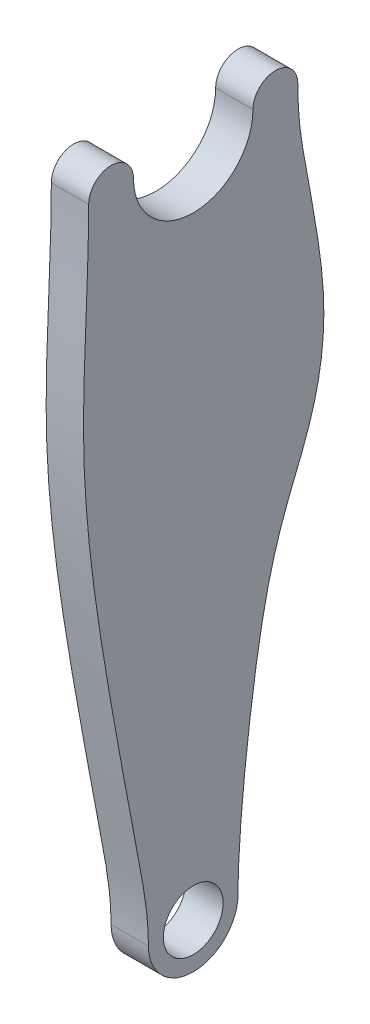
ISO-10303-21;
HEADER;
FILE_DESCRIPTION(('STEP AP214'),'2;1');
FILE_NAME('part.step','',(''),(''),'','','');
FILE_SCHEMA(('AUTOMOTIVE_DESIGN { 1 0 10303 214 1 1 1 1 }'));
ENDSEC;
DATA;
#1=APPLICATION_CONTEXT('core data for automotive mechanical design processes');
#2=APPLICATION_PROTOCOL_DEFINITION('international standard','automotive_design',2000,#1);
#3=PRODUCT_CONTEXT('',#1,'mechanical');
#4=PRODUCT('Part','Part','',(#3));
#5=PRODUCT_RELATED_PRODUCT_CATEGORY('part','',(#4));
#6=PRODUCT_DEFINITION_FORMATION('','',#4);
#7=PRODUCT_DEFINITION_CONTEXT('part definition',#1,'design');
#8=PRODUCT_DEFINITION('design','',#6,#7);
#9=PRODUCT_DEFINITION_SHAPE('','',#8);
#10=(LENGTH_UNIT() NAMED_UNIT(*) SI_UNIT(.MILLI.,.METRE.));
#11=(NAMED_UNIT(*) PLANE_ANGLE_UNIT() SI_UNIT($,.RADIAN.));
#12=(NAMED_UNIT(*) SI_UNIT($,.STERADIAN.) SOLID_ANGLE_UNIT());
#13=UNCERTAINTY_MEASURE_WITH_UNIT(LENGTH_MEASURE(1.E-05),#10,'distance_accuracy_value','');
#14=(GEOMETRIC_REPRESENTATION_CONTEXT(3) GLOBAL_UNCERTAINTY_ASSIGNED_CONTEXT((#13)) GLOBAL_UNIT_ASSIGNED_CONTEXT((#10,
#11,#12)) REPRESENTATION_CONTEXT('',''));
#15=CARTESIAN_POINT('',(0.,0.,0.));
#16=DIRECTION('',(0.,0.,1.));
#17=DIRECTION('',(1.,0.,0.));
#18=AXIS2_PLACEMENT_3D('',#15,#16,#17);
#19=CARTESIAN_POINT('',(10.,0.,-28.));
#20=CARTESIAN_POINT('',(10.,-7.11889913552066,-28.));
#21=CARTESIAN_POINT('',(10.,-17.3743165491548,-29.3200373597356));
#22=CARTESIAN_POINT('',(10.,-65.1845773304526,-39.2187090072054));
#23=CARTESIAN_POINT('',(10.,-94.6220418180742,-24.4893893604008));
#24=CARTESIAN_POINT('',(10.,-123.05598928135,-16.8395502400097));
#25=CARTESIAN_POINT('',(10.,-165.456503480137,-12.));
#26=CARTESIAN_POINT('',(10.,-180.,-12.));
#27=B_SPLINE_CURVE_WITH_KNOTS('',3,(#19,#20,#21,#22,#23,#24,#25,#26),.UNSPECIFIED.,.F.,.F.,(4,1,
1,1,1,4),(0.,0.0842862465994689,0.187609719140455,0.382215489080244,0.559766900242752,
0.781850651208779),.UNSPECIFIED.);
#28=DIRECTION('',(-1.,0.,0.));
#29=VECTOR('',#28,1.);
#30=SURFACE_OF_LINEAR_EXTRUSION('',#27,#29);
#31=CARTESIAN_POINT('',(0.,0.,-28.));
#32=CARTESIAN_POINT('',(0.,-7.11889913552066,-28.));
#33=CARTESIAN_POINT('',(0.,-17.3743165491548,-29.3200373597356));
#34=CARTESIAN_POINT('',(0.,-65.1845773304526,-39.2187090072054));
#35=CARTESIAN_POINT('',(0.,-94.6220418180742,-24.4893893604008));
#36=CARTESIAN_POINT('',(0.,-123.05598928135,-16.8395502400097));
#37=CARTESIAN_POINT('',(0.,-165.456503480137,-12.));
#38=CARTESIAN_POINT('',(0.,-180.,-12.));
#39=B_SPLINE_CURVE_WITH_KNOTS('',3,(#31,#32,#33,#34,#35,#36,#37,#38),.UNSPECIFIED.,.F.,.F.,(4,1,
1,1,1,4),(0.,0.0842862465994689,0.187609719140455,0.382215489080244,0.559766900242752,
0.781850651208779),.UNSPECIFIED.);
#40=CARTESIAN_POINT('',(0.,0.,-28.));
#41=VERTEX_POINT('',#40);
#42=CARTESIAN_POINT('',(0.,-180.,-12.));
#43=VERTEX_POINT('',#42);
#44=EDGE_CURVE('E159',#41,#43,#39,.T.);
#45=ORIENTED_EDGE('',*,*,#44,.F.);
#46=DIRECTION('',(-1.,0.,0.));
#47=VECTOR('',#46,1.);
#48=CARTESIAN_POINT('',(10.,0.,-28.));
#49=LINE('',#48,#47);
#50=CARTESIAN_POINT('',(10.,0.,-28.));
#51=VERTEX_POINT('',#50);
#52=EDGE_CURVE('E11',#51,#41,#49,.T.);
#53=ORIENTED_EDGE('',*,*,#52,.F.);
#54=CARTESIAN_POINT('',(10.,-180.,-12.));
#55=VERTEX_POINT('',#54);
#56=EDGE_CURVE('E186',#51,#55,#27,.T.);
#57=ORIENTED_EDGE('',*,*,#56,.T.);
#58=DIRECTION('',(-1.,0.,0.));
#59=VECTOR('',#58,1.);
#60=CARTESIAN_POINT('',(10.,-180.,-12.));
#61=LINE('',#60,#59);
#62=EDGE_CURVE('E57',#55,#43,#61,.T.);
#63=ORIENTED_EDGE('',*,*,#62,.T.);
#64=EDGE_LOOP('',(#45,#53,#57,#63));
#65=FACE_BOUND('',#64,.T.);
#66=ADVANCED_FACE('F39',(#65),#30,.T.);
#67=CARTESIAN_POINT('',(10.,0.,-22.));
#68=DIRECTION('',(-1.,0.,0.));
#69=DIRECTION('',(0.,0.,1.));
#70=AXIS2_PLACEMENT_3D('',#67,#68,#69);
#71=CYLINDRICAL_SURFACE('',#70,6.);
#72=CARTESIAN_POINT('',(0.,0.,-22.));
#73=DIRECTION('',(1.,0.,0.));
#74=DIRECTION('',(0.,0.,-1.));
#75=AXIS2_PLACEMENT_3D('',#72,#73,#74);
#76=CIRCLE('',#75,6.);
#77=CARTESIAN_POINT('',(0.,0.,-16.));
#78=VERTEX_POINT('',#77);
#79=EDGE_CURVE('E153',#78,#41,#76,.F.);
#80=ORIENTED_EDGE('',*,*,#79,.F.);
#81=DIRECTION('',(-1.,0.,0.));
#82=VECTOR('',#81,1.);
#83=CARTESIAN_POINT('',(10.,0.,-16.));
#84=LINE('',#83,#82);
#85=CARTESIAN_POINT('',(10.,0.,-16.));
#86=VERTEX_POINT('',#85);
#87=EDGE_CURVE('E49',#86,#78,#84,.T.);
#88=ORIENTED_EDGE('',*,*,#87,.F.);
#89=CARTESIAN_POINT('',(10.,0.,-22.));
#90=DIRECTION('',(1.,0.,0.));
#91=DIRECTION('',(0.,0.,-1.));
#92=AXIS2_PLACEMENT_3D('',#89,#90,#91);
#93=CIRCLE('',#92,6.);
#94=EDGE_CURVE('E194',#86,#51,#93,.F.);
#95=ORIENTED_EDGE('',*,*,#94,.T.);
#96=ORIENTED_EDGE('',*,*,#52,.T.);
#97=EDGE_LOOP('',(#80,#88,#95,#96));
#98=FACE_BOUND('',#97,.T.);
#99=ADVANCED_FACE('F144',(#98),#71,.T.);
#100=CARTESIAN_POINT('',(10.,0.,0.));
#101=DIRECTION('',(-1.,0.,0.));
#102=DIRECTION('',(0.,0.,1.));
#103=AXIS2_PLACEMENT_3D('',#100,#101,#102);
#104=CYLINDRICAL_SURFACE('',#103,16.);
#105=CARTESIAN_POINT('',(0.,0.,0.));
#106=DIRECTION('',(1.,0.,0.));
#107=DIRECTION('',(0.,0.,-1.));
#108=AXIS2_PLACEMENT_3D('',#105,#106,#107);
#109=CIRCLE('',#108,16.);
#110=CARTESIAN_POINT('',(0.,0.,16.));
#111=VERTEX_POINT('',#110);
#112=EDGE_CURVE('E158',#111,#78,#109,.T.);
#113=ORIENTED_EDGE('',*,*,#112,.F.);
#114=DIRECTION('',(-1.,0.,0.));
#115=VECTOR('',#114,1.);
#116=CARTESIAN_POINT('',(10.,0.,16.));
#117=LINE('',#116,#115);
#118=CARTESIAN_POINT('',(10.,0.,16.));
#119=VERTEX_POINT('',#118);
#120=EDGE_CURVE('E117',#119,#111,#117,.T.);
#121=ORIENTED_EDGE('',*,*,#120,.F.);
#122=CARTESIAN_POINT('',(10.,0.,0.));
#123=DIRECTION('',(1.,0.,0.));
#124=DIRECTION('',(0.,0.,-1.));
#125=AXIS2_PLACEMENT_3D('',#122,#123,#124);
#126=CIRCLE('',#125,16.);
#127=EDGE_CURVE('E105',#119,#86,#126,.T.);
#128=ORIENTED_EDGE('',*,*,#127,.T.);
#129=ORIENTED_EDGE('',*,*,#87,.T.);
#130=EDGE_LOOP('',(#113,#121,#128,#129));
#131=FACE_BOUND('',#130,.T.);
#132=ADVANCED_FACE('F142',(#131),#104,.F.);
#133=CARTESIAN_POINT('',(10.,0.,22.));
#134=DIRECTION('',(-1.,0.,0.));
#135=DIRECTION('',(0.,0.,1.));
#136=AXIS2_PLACEMENT_3D('',#133,#134,#135);
#137=CYLINDRICAL_SURFACE('',#136,6.);
#138=CARTESIAN_POINT('',(0.,0.,22.));
#139=DIRECTION('',(1.,0.,0.));
#140=DIRECTION('',(0.,0.,-1.));
#141=AXIS2_PLACEMENT_3D('',#138,#139,#140);
#142=CIRCLE('',#141,6.);
#143=CARTESIAN_POINT('',(0.,0.,28.));
#144=VERTEX_POINT('',#143);
#145=EDGE_CURVE('E113',#111,#144,#142,.T.);
#146=ORIENTED_EDGE('',*,*,#145,.T.);
#147=DIRECTION('',(-1.,0.,0.));
#148=VECTOR('',#147,1.);
#149=CARTESIAN_POINT('',(10.,0.,28.));
#150=LINE('',#149,#148);
#151=CARTESIAN_POINT('',(10.,0.,28.));
#152=VERTEX_POINT('',#151);
#153=EDGE_CURVE('E110',#152,#144,#150,.T.);
#154=ORIENTED_EDGE('',*,*,#153,.F.);
#155=CARTESIAN_POINT('',(10.,0.,22.));
#156=DIRECTION('',(1.,0.,0.));
#157=DIRECTION('',(0.,0.,-1.));
#158=AXIS2_PLACEMENT_3D('',#155,#156,#157);
#159=CIRCLE('',#158,6.);
#160=EDGE_CURVE('E96',#119,#152,#159,.T.);
#161=ORIENTED_EDGE('',*,*,#160,.F.);
#162=ORIENTED_EDGE('',*,*,#120,.T.);
#163=EDGE_LOOP('',(#146,#154,#161,#162));
#164=FACE_BOUND('',#163,.T.);
#165=ADVANCED_FACE('F111',(#164),#137,.T.);
#166=CARTESIAN_POINT('',(10.,0.,28.));
#167=CARTESIAN_POINT('',(10.,-19.8414796893552,28.));
#168=CARTESIAN_POINT('',(10.,-55.9450680651113,31.4918470711201));
#169=CARTESIAN_POINT('',(10.,-109.086480387823,24.0978909246459));
#170=CARTESIAN_POINT('',(10.,-149.426112932214,16.3697111098206));
#171=CARTESIAN_POINT('',(10.,-172.544928322269,12.));
#172=CARTESIAN_POINT('',(10.,-180.,12.));
#173=B_SPLINE_CURVE_WITH_KNOTS('',3,(#166,#167,#168,#169,#170,#171,#172),.UNSPECIFIED.,.F.,.F.,
(4,1,1,1,4),(0.,0.318521568120722,0.610749870942176,0.878130317017907,1.),.UNSPECIFIED.);
#174=DIRECTION('',(-1.,0.,0.));
#175=VECTOR('',#174,1.);
#176=SURFACE_OF_LINEAR_EXTRUSION('',#173,#175);
#177=CARTESIAN_POINT('',(0.,0.,28.));
#178=CARTESIAN_POINT('',(0.,-19.8414796893552,28.));
#179=CARTESIAN_POINT('',(0.,-55.9450680651113,31.4918470711201));
#180=CARTESIAN_POINT('',(0.,-109.086480387823,24.0978909246459));
#181=CARTESIAN_POINT('',(0.,-149.426112932214,16.3697111098206));
#182=CARTESIAN_POINT('',(0.,-172.544928322269,12.));
#183=CARTESIAN_POINT('',(0.,-180.,12.));
#184=B_SPLINE_CURVE_WITH_KNOTS('',3,(#177,#178,#179,#180,#181,#182,#183),.UNSPECIFIED.,.F.,.F.,
(4,1,1,1,4),(0.,0.318521568120722,0.610749870942176,0.878130317017907,1.),.UNSPECIFIED.);
#185=CARTESIAN_POINT('',(0.,-180.,12.));
#186=VERTEX_POINT('',#185);
#187=EDGE_CURVE('E167',#144,#186,#184,.T.);
#188=ORIENTED_EDGE('',*,*,#187,.T.);
#189=DIRECTION('',(-1.,0.,0.));
#190=VECTOR('',#189,1.);
#191=CARTESIAN_POINT('',(10.,-180.,12.));
#192=LINE('',#191,#190);
#193=CARTESIAN_POINT('',(10.,-180.,12.));
#194=VERTEX_POINT('',#193);
#195=EDGE_CURVE('E77',#194,#186,#192,.T.);
#196=ORIENTED_EDGE('',*,*,#195,.F.);
#197=EDGE_CURVE('E102',#152,#194,#173,.T.);
#198=ORIENTED_EDGE('',*,*,#197,.F.);
#199=ORIENTED_EDGE('',*,*,#153,.T.);
#200=EDGE_LOOP('',(#188,#196,#198,#199));
#201=FACE_BOUND('',#200,.T.);
#202=ADVANCED_FACE('F119',(#201),#176,.F.);
#203=CARTESIAN_POINT('',(10.,-180.,0.));
#204=DIRECTION('',(-1.,0.,0.));
#205=DIRECTION('',(0.,0.,1.));
#206=AXIS2_PLACEMENT_3D('',#203,#204,#205);
#207=CYLINDRICAL_SURFACE('',#206,12.);
#208=CARTESIAN_POINT('',(0.,-180.,0.));
#209=DIRECTION('',(1.,0.,0.));
#210=DIRECTION('',(0.,0.,-1.));
#211=AXIS2_PLACEMENT_3D('',#208,#209,#210);
#212=CIRCLE('',#211,12.);
#213=EDGE_CURVE('E175',#43,#186,#212,.F.);
#214=ORIENTED_EDGE('',*,*,#213,.F.);
#215=ORIENTED_EDGE('',*,*,#62,.F.);
#216=CARTESIAN_POINT('',(10.,-180.,0.));
#217=DIRECTION('',(1.,0.,0.));
#218=DIRECTION('',(0.,0.,-1.));
#219=AXIS2_PLACEMENT_3D('',#216,#217,#218);
#220=CIRCLE('',#219,12.);
#221=EDGE_CURVE('E121',#55,#194,#220,.F.);
#222=ORIENTED_EDGE('',*,*,#221,.T.);
#223=ORIENTED_EDGE('',*,*,#195,.T.);
#224=EDGE_LOOP('',(#214,#215,#222,#223));
#225=FACE_BOUND('',#224,.T.);
#226=ADVANCED_FACE('F138',(#225),#207,.T.);
#227=CARTESIAN_POINT('',(10.,-180.,0.));
#228=DIRECTION('',(-1.,0.,0.));
#229=DIRECTION('',(0.,0.,1.));
#230=AXIS2_PLACEMENT_3D('',#227,#228,#229);
#231=CYLINDRICAL_SURFACE('',#230,8.);
#232=CARTESIAN_POINT('',(10.,-180.,0.));
#233=DIRECTION('',(1.,0.,0.));
#234=DIRECTION('',(0.,0.,-1.));
#235=AXIS2_PLACEMENT_3D('',#232,#233,#234);
#236=CIRCLE('',#235,8.);
#237=CARTESIAN_POINT('',(10.,-180.,-8.));
#238=VERTEX_POINT('',#237);
#239=EDGE_CURVE('E124',#238,#238,#236,.T.);
#240=ORIENTED_EDGE('',*,*,#239,.T.);
#241=EDGE_LOOP('',(#240));
#242=FACE_BOUND('',#241,.T.);
#243=CARTESIAN_POINT('',(0.,-180.,0.));
#244=DIRECTION('',(1.,0.,0.));
#245=DIRECTION('',(0.,0.,-1.));
#246=AXIS2_PLACEMENT_3D('',#243,#244,#245);
#247=CIRCLE('',#246,8.);
#248=CARTESIAN_POINT('',(0.,-180.,-8.));
#249=VERTEX_POINT('',#248);
#250=EDGE_CURVE('E182',#249,#249,#247,.T.);
#251=ORIENTED_EDGE('',*,*,#250,.F.);
#252=EDGE_LOOP('',(#251));
#253=FACE_BOUND('',#252,.T.);
#254=ADVANCED_FACE('F205',(#242,#253),#231,.F.);
#255=CARTESIAN_POINT('',(10.,0.,0.));
#256=DIRECTION('',(1.,0.,0.));
#257=DIRECTION('',(0.,0.,-1.));
#258=AXIS2_PLACEMENT_3D('',#255,#256,#257);
#259=PLANE('',#258);
#260=ORIENTED_EDGE('',*,*,#56,.F.);
#261=ORIENTED_EDGE('',*,*,#94,.F.);
#262=ORIENTED_EDGE('',*,*,#127,.F.);
#263=ORIENTED_EDGE('',*,*,#160,.T.);
#264=ORIENTED_EDGE('',*,*,#197,.T.);
#265=ORIENTED_EDGE('',*,*,#221,.F.);
#266=EDGE_LOOP('',(#260,#261,#262,#263,#264,#265));
#267=FACE_BOUND('',#266,.T.);
#268=ORIENTED_EDGE('',*,*,#239,.F.);
#269=EDGE_LOOP('',(#268));
#270=FACE_BOUND('',#269,.T.);
#271=ADVANCED_FACE('F98',(#267,#270),#259,.T.);
#272=CARTESIAN_POINT('',(0.,0.,0.));
#273=DIRECTION('',(1.,0.,0.));
#274=DIRECTION('',(0.,0.,-1.));
#275=AXIS2_PLACEMENT_3D('',#272,#273,#274);
#276=PLANE('',#275);
#277=ORIENTED_EDGE('',*,*,#44,.T.);
#278=ORIENTED_EDGE('',*,*,#213,.T.);
#279=ORIENTED_EDGE('',*,*,#187,.F.);
#280=ORIENTED_EDGE('',*,*,#145,.F.);
#281=ORIENTED_EDGE('',*,*,#112,.T.);
#282=ORIENTED_EDGE('',*,*,#79,.T.);
#283=EDGE_LOOP('',(#277,#278,#279,#280,#281,#282));
#284=FACE_BOUND('',#283,.T.);
#285=ORIENTED_EDGE('',*,*,#250,.T.);
#286=EDGE_LOOP('',(#285));
#287=FACE_BOUND('',#286,.T.);
#288=ADVANCED_FACE('F162',(#284,#287),#276,.F.);
#289=CLOSED_SHELL('',(#66,#99,#132,#165,#202,#226,#254,#271,#288));
#290=MANIFOLD_SOLID_BREP('B2',#289);
#291=ADVANCED_BREP_SHAPE_REPRESENTATION('',(#18,#290),#14);
#292=SHAPE_DEFINITION_REPRESENTATION(#9,#291);
ENDSEC;
END-ISO-10303-21;
